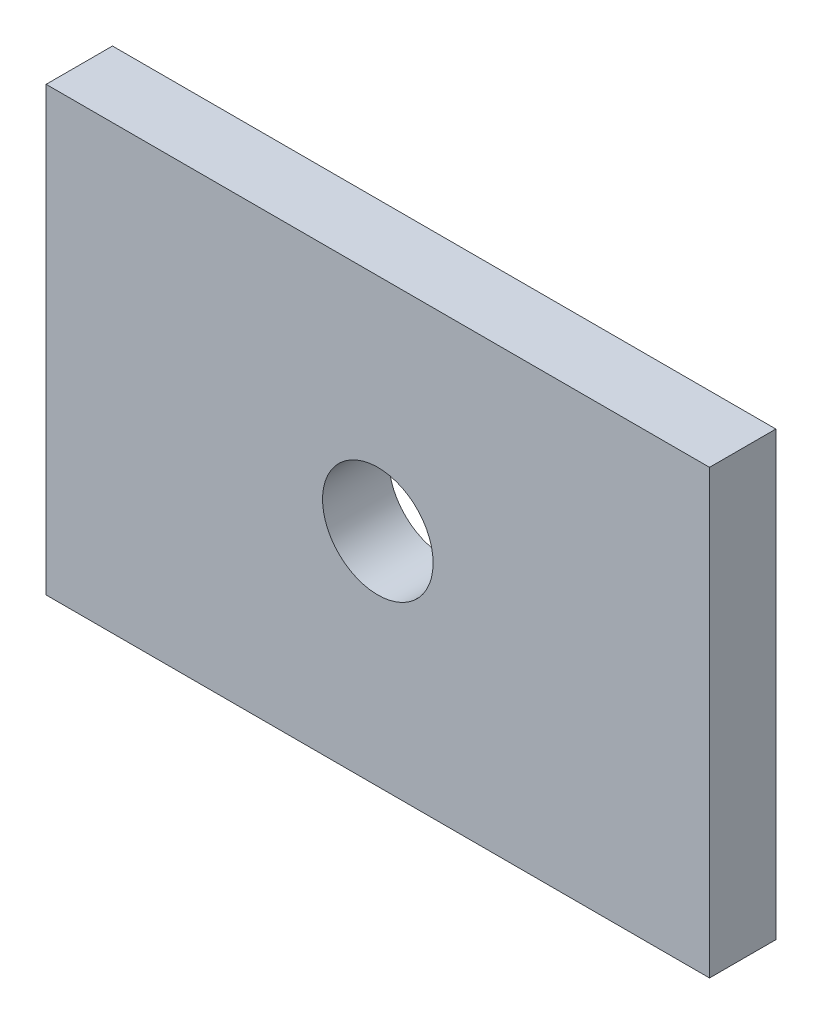
ISO-10303-21;
HEADER;
FILE_DESCRIPTION(('STEP AP214'),'2;1');
FILE_NAME('part.step','',(''),(''),'','','');
FILE_SCHEMA(('AUTOMOTIVE_DESIGN { 1 0 10303 214 1 1 1 1 }'));
ENDSEC;
DATA;
#1=APPLICATION_CONTEXT('core data for automotive mechanical design processes');
#2=APPLICATION_PROTOCOL_DEFINITION('international standard','automotive_design',2000,#1);
#3=PRODUCT_CONTEXT('',#1,'mechanical');
#4=PRODUCT('Part','Part','',(#3));
#5=PRODUCT_RELATED_PRODUCT_CATEGORY('part','',(#4));
#6=PRODUCT_DEFINITION_FORMATION('','',#4);
#7=PRODUCT_DEFINITION_CONTEXT('part definition',#1,'design');
#8=PRODUCT_DEFINITION('design','',#6,#7);
#9=PRODUCT_DEFINITION_SHAPE('','',#8);
#10=(LENGTH_UNIT() NAMED_UNIT(*) SI_UNIT(.MILLI.,.METRE.));
#11=(NAMED_UNIT(*) PLANE_ANGLE_UNIT() SI_UNIT($,.RADIAN.));
#12=(NAMED_UNIT(*) SI_UNIT($,.STERADIAN.) SOLID_ANGLE_UNIT());
#13=UNCERTAINTY_MEASURE_WITH_UNIT(LENGTH_MEASURE(1.E-05),#10,'distance_accuracy_value','');
#14=(GEOMETRIC_REPRESENTATION_CONTEXT(3) GLOBAL_UNCERTAINTY_ASSIGNED_CONTEXT((#13)) GLOBAL_UNIT_ASSIGNED_CONTEXT((#10,
#11,#12)) REPRESENTATION_CONTEXT('',''));
#15=CARTESIAN_POINT('',(0.,0.,0.));
#16=DIRECTION('',(0.,0.,1.));
#17=DIRECTION('',(1.,0.,0.));
#18=AXIS2_PLACEMENT_3D('',#15,#16,#17);
#19=CARTESIAN_POINT('',(-26.2656136087485,68.2374240583232,3.));
#20=DIRECTION('',(1.,0.,0.));
#21=DIRECTION('',(0.,1.,0.));
#22=AXIS2_PLACEMENT_3D('',#19,#20,#21);
#23=PLANE('',#22);
#24=DIRECTION('',(0.,-1.,0.));
#25=VECTOR('',#24,1.);
#26=CARTESIAN_POINT('',(-26.2656136087485,68.2374240583232,0.));
#27=LINE('',#26,#25);
#28=CARTESIAN_POINT('',(-26.2656136087485,68.2374240583232,0.));
#29=VERTEX_POINT('',#28);
#30=CARTESIAN_POINT('',(-26.2656136087485,48.2374240583232,0.));
#31=VERTEX_POINT('',#30);
#32=EDGE_CURVE('E108',#29,#31,#27,.T.);
#33=ORIENTED_EDGE('',*,*,#32,.T.);
#34=DIRECTION('',(0.,0.,-1.));
#35=VECTOR('',#34,1.);
#36=CARTESIAN_POINT('',(-26.2656136087485,48.2374240583232,3.));
#37=LINE('',#36,#35);
#38=CARTESIAN_POINT('',(-26.2656136087485,48.2374240583232,3.));
#39=VERTEX_POINT('',#38);
#40=EDGE_CURVE('E11',#39,#31,#37,.T.);
#41=ORIENTED_EDGE('',*,*,#40,.F.);
#42=DIRECTION('',(0.,-1.,0.));
#43=VECTOR('',#42,1.);
#44=CARTESIAN_POINT('',(-26.2656136087485,68.2374240583232,3.));
#45=LINE('',#44,#43);
#46=CARTESIAN_POINT('',(-26.2656136087485,68.2374240583232,3.));
#47=VERTEX_POINT('',#46);
#48=EDGE_CURVE('E94',#47,#39,#45,.T.);
#49=ORIENTED_EDGE('',*,*,#48,.F.);
#50=DIRECTION('',(0.,0.,-1.));
#51=VECTOR('',#50,1.);
#52=CARTESIAN_POINT('',(-26.2656136087485,68.2374240583232,3.));
#53=LINE('',#52,#51);
#54=EDGE_CURVE('E61',#47,#29,#53,.T.);
#55=ORIENTED_EDGE('',*,*,#54,.T.);
#56=EDGE_LOOP('',(#33,#41,#49,#55));
#57=FACE_BOUND('',#56,.T.);
#58=ADVANCED_FACE('F45',(#57),#23,.F.);
#59=CARTESIAN_POINT('',(-26.2656136087485,48.2374240583232,3.));
#60=DIRECTION('',(0.,1.,0.));
#61=DIRECTION('',(0.,0.,1.));
#62=AXIS2_PLACEMENT_3D('',#59,#60,#61);
#63=PLANE('',#62);
#64=DIRECTION('',(1.,0.,0.));
#65=VECTOR('',#64,1.);
#66=CARTESIAN_POINT('',(-26.2656136087485,48.2374240583232,0.));
#67=LINE('',#66,#65);
#68=CARTESIAN_POINT('',(3.73438639125154,48.2374240583232,0.));
#69=VERTEX_POINT('',#68);
#70=EDGE_CURVE('E99',#31,#69,#67,.T.);
#71=ORIENTED_EDGE('',*,*,#70,.T.);
#72=DIRECTION('',(0.,0.,-1.));
#73=VECTOR('',#72,1.);
#74=CARTESIAN_POINT('',(3.73438639125154,48.2374240583232,3.));
#75=LINE('',#74,#73);
#76=CARTESIAN_POINT('',(3.73438639125154,48.2374240583232,3.));
#77=VERTEX_POINT('',#76);
#78=EDGE_CURVE('E53',#77,#69,#75,.T.);
#79=ORIENTED_EDGE('',*,*,#78,.F.);
#80=DIRECTION('',(1.,0.,0.));
#81=VECTOR('',#80,1.);
#82=CARTESIAN_POINT('',(-26.2656136087485,48.2374240583232,3.));
#83=LINE('',#82,#81);
#84=EDGE_CURVE('E86',#39,#77,#83,.T.);
#85=ORIENTED_EDGE('',*,*,#84,.F.);
#86=ORIENTED_EDGE('',*,*,#40,.T.);
#87=EDGE_LOOP('',(#71,#79,#85,#86));
#88=FACE_BOUND('',#87,.T.);
#89=ADVANCED_FACE('F98',(#88),#63,.F.);
#90=CARTESIAN_POINT('',(3.73438639125154,68.2374240583232,3.));
#91=DIRECTION('',(1.,0.,0.));
#92=DIRECTION('',(0.,0.,-1.));
#93=AXIS2_PLACEMENT_3D('',#90,#91,#92);
#94=PLANE('',#93);
#95=DIRECTION('',(0.,-1.,0.));
#96=VECTOR('',#95,1.);
#97=CARTESIAN_POINT('',(3.73438639125154,68.2374240583232,0.));
#98=LINE('',#97,#96);
#99=CARTESIAN_POINT('',(3.73438639125154,68.2374240583232,0.));
#100=VERTEX_POINT('',#99);
#101=EDGE_CURVE('E112',#100,#69,#98,.T.);
#102=ORIENTED_EDGE('',*,*,#101,.F.);
#103=DIRECTION('',(0.,0.,-1.));
#104=VECTOR('',#103,1.);
#105=CARTESIAN_POINT('',(3.73438639125154,68.2374240583232,3.));
#106=LINE('',#105,#104);
#107=CARTESIAN_POINT('',(3.73438639125154,68.2374240583232,3.));
#108=VERTEX_POINT('',#107);
#109=EDGE_CURVE('E75',#108,#100,#106,.T.);
#110=ORIENTED_EDGE('',*,*,#109,.F.);
#111=DIRECTION('',(0.,-1.,0.));
#112=VECTOR('',#111,1.);
#113=CARTESIAN_POINT('',(3.73438639125154,68.2374240583232,3.));
#114=LINE('',#113,#112);
#115=EDGE_CURVE('E93',#108,#77,#114,.T.);
#116=ORIENTED_EDGE('',*,*,#115,.T.);
#117=ORIENTED_EDGE('',*,*,#78,.T.);
#118=EDGE_LOOP('',(#102,#110,#116,#117));
#119=FACE_BOUND('',#118,.T.);
#120=ADVANCED_FACE('F102',(#119),#94,.T.);
#121=CARTESIAN_POINT('',(-26.2656136087485,68.2374240583232,3.));
#122=DIRECTION('',(0.,1.,0.));
#123=DIRECTION('',(0.,0.,1.));
#124=AXIS2_PLACEMENT_3D('',#121,#122,#123);
#125=PLANE('',#124);
#126=DIRECTION('',(1.,0.,0.));
#127=VECTOR('',#126,1.);
#128=CARTESIAN_POINT('',(-26.2656136087485,68.2374240583232,0.));
#129=LINE('',#128,#127);
#130=EDGE_CURVE('E114',#29,#100,#129,.T.);
#131=ORIENTED_EDGE('',*,*,#130,.F.);
#132=ORIENTED_EDGE('',*,*,#54,.F.);
#133=DIRECTION('',(1.,0.,0.));
#134=VECTOR('',#133,1.);
#135=CARTESIAN_POINT('',(-26.2656136087485,68.2374240583232,3.));
#136=LINE('',#135,#134);
#137=EDGE_CURVE('E103',#47,#108,#136,.T.);
#138=ORIENTED_EDGE('',*,*,#137,.T.);
#139=ORIENTED_EDGE('',*,*,#109,.T.);
#140=EDGE_LOOP('',(#131,#132,#138,#139));
#141=FACE_BOUND('',#140,.T.);
#142=ADVANCED_FACE('F135',(#141),#125,.T.);
#143=CARTESIAN_POINT('',(0.,0.,3.));
#144=DIRECTION('',(0.,0.,1.));
#145=DIRECTION('',(1.,0.,0.));
#146=AXIS2_PLACEMENT_3D('',#143,#144,#145);
#147=PLANE('',#146);
#148=CARTESIAN_POINT('',(-11.2656136087485,58.2374240583232,3.));
#149=DIRECTION('',(0.,0.,1.));
#150=DIRECTION('',(1.,0.,0.));
#151=AXIS2_PLACEMENT_3D('',#148,#149,#150);
#152=CIRCLE('',#151,2.5);
#153=CARTESIAN_POINT('',(-8.76561360874847,58.2374240583232,3.));
#154=VERTEX_POINT('',#153);
#155=EDGE_CURVE('E120',#154,#154,#152,.T.);
#156=ORIENTED_EDGE('',*,*,#155,.F.);
#157=EDGE_LOOP('',(#156));
#158=FACE_BOUND('',#157,.T.);
#159=ORIENTED_EDGE('',*,*,#48,.T.);
#160=ORIENTED_EDGE('',*,*,#84,.T.);
#161=ORIENTED_EDGE('',*,*,#115,.F.);
#162=ORIENTED_EDGE('',*,*,#137,.F.);
#163=EDGE_LOOP('',(#159,#160,#161,#162));
#164=FACE_BOUND('',#163,.T.);
#165=ADVANCED_FACE('F90',(#158,#164),#147,.T.);
#166=CARTESIAN_POINT('',(0.,0.,0.));
#167=DIRECTION('',(0.,0.,1.));
#168=DIRECTION('',(1.,0.,0.));
#169=AXIS2_PLACEMENT_3D('',#166,#167,#168);
#170=PLANE('',#169);
#171=CARTESIAN_POINT('',(-11.2656136087485,58.2374240583232,0.));
#172=DIRECTION('',(0.,0.,1.));
#173=DIRECTION('',(1.,0.,0.));
#174=AXIS2_PLACEMENT_3D('',#171,#172,#173);
#175=CIRCLE('',#174,2.5);
#176=CARTESIAN_POINT('',(-8.76561360874847,58.2374240583232,0.));
#177=VERTEX_POINT('',#176);
#178=EDGE_CURVE('E110',#177,#177,#175,.T.);
#179=ORIENTED_EDGE('',*,*,#178,.T.);
#180=EDGE_LOOP('',(#179));
#181=FACE_BOUND('',#180,.T.);
#182=ORIENTED_EDGE('',*,*,#32,.F.);
#183=ORIENTED_EDGE('',*,*,#130,.T.);
#184=ORIENTED_EDGE('',*,*,#101,.T.);
#185=ORIENTED_EDGE('',*,*,#70,.F.);
#186=EDGE_LOOP('',(#182,#183,#184,#185));
#187=FACE_BOUND('',#186,.T.);
#188=ADVANCED_FACE('F126',(#181,#187),#170,.F.);
#189=CARTESIAN_POINT('',(-11.2656136087485,58.2374240583232,0.));
#190=DIRECTION('',(0.,0.,1.));
#191=DIRECTION('',(1.,0.,0.));
#192=AXIS2_PLACEMENT_3D('',#189,#190,#191);
#193=CYLINDRICAL_SURFACE('',#192,2.5);
#194=ORIENTED_EDGE('',*,*,#178,.F.);
#195=EDGE_LOOP('',(#194));
#196=FACE_BOUND('',#195,.T.);
#197=ORIENTED_EDGE('',*,*,#155,.T.);
#198=EDGE_LOOP('',(#197));
#199=FACE_BOUND('',#198,.T.);
#200=ADVANCED_FACE('F128',(#196,#199),#193,.F.);
#201=CLOSED_SHELL('',(#58,#89,#120,#142,#165,#188,#200));
#202=MANIFOLD_SOLID_BREP('B2',#201);
#203=ADVANCED_BREP_SHAPE_REPRESENTATION('',(#18,#202),#14);
#204=SHAPE_DEFINITION_REPRESENTATION(#9,#203);
ENDSEC;
END-ISO-10303-21;
